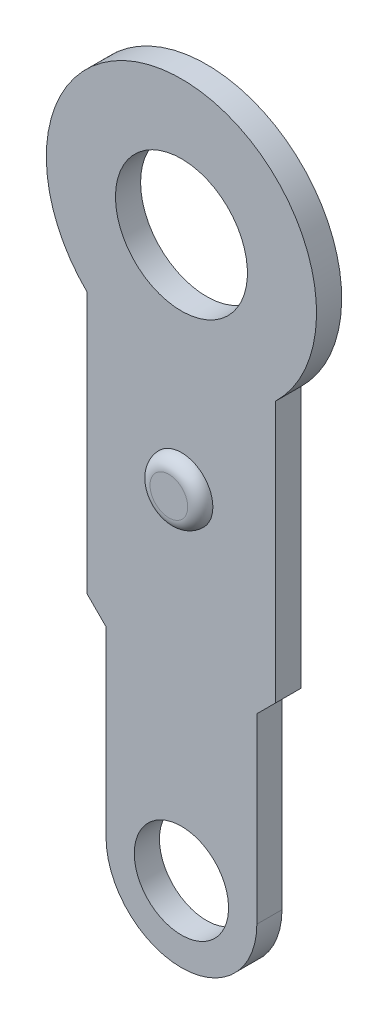
ISO-10303-21;
HEADER;
FILE_DESCRIPTION(('STEP AP214'),'2;1');
FILE_NAME('part.step','',(''),(''),'','','');
FILE_SCHEMA(('AUTOMOTIVE_DESIGN { 1 0 10303 214 1 1 1 1 }'));
ENDSEC;
DATA;
#1=APPLICATION_CONTEXT('core data for automotive mechanical design processes');
#2=APPLICATION_PROTOCOL_DEFINITION('international standard','automotive_design',2000,#1);
#3=PRODUCT_CONTEXT('',#1,'mechanical');
#4=PRODUCT('Part','Part','',(#3));
#5=PRODUCT_RELATED_PRODUCT_CATEGORY('part','',(#4));
#6=PRODUCT_DEFINITION_FORMATION('','',#4);
#7=PRODUCT_DEFINITION_CONTEXT('part definition',#1,'design');
#8=PRODUCT_DEFINITION('design','',#6,#7);
#9=PRODUCT_DEFINITION_SHAPE('','',#8);
#10=(LENGTH_UNIT() NAMED_UNIT(*) SI_UNIT(.MILLI.,.METRE.));
#11=(NAMED_UNIT(*) PLANE_ANGLE_UNIT() SI_UNIT($,.RADIAN.));
#12=(NAMED_UNIT(*) SI_UNIT($,.STERADIAN.) SOLID_ANGLE_UNIT());
#13=UNCERTAINTY_MEASURE_WITH_UNIT(LENGTH_MEASURE(1.E-05),#10,'distance_accuracy_value','');
#14=(GEOMETRIC_REPRESENTATION_CONTEXT(3) GLOBAL_UNCERTAINTY_ASSIGNED_CONTEXT((#13)) GLOBAL_UNIT_ASSIGNED_CONTEXT((#10,
#11,#12)) REPRESENTATION_CONTEXT('',''));
#15=CARTESIAN_POINT('',(0.,0.,0.));
#16=DIRECTION('',(0.,0.,1.));
#17=DIRECTION('',(1.,0.,0.));
#18=AXIS2_PLACEMENT_3D('',#15,#16,#17);
#19=CARTESIAN_POINT('',(0.,-3.5,0.6));
#20=DIRECTION('',(0.,0.,1.));
#21=DIRECTION('',(1.,0.,0.));
#22=AXIS2_PLACEMENT_3D('',#19,#20,#21);
#23=PLANE('',#22);
#24=CARTESIAN_POINT('',(0.,-3.5,0.6));
#25=DIRECTION('',(0.,0.,1.));
#26=DIRECTION('',(1.,0.,0.));
#27=AXIS2_PLACEMENT_3D('',#24,#25,#26);
#28=CIRCLE('',#27,0.3);
#29=CARTESIAN_POINT('',(0.3,-3.5,0.6));
#30=VERTEX_POINT('',#29);
#31=EDGE_CURVE('E20',#30,#30,#28,.F.);
#32=ORIENTED_EDGE('',*,*,#31,.F.);
#33=EDGE_LOOP('',(#32));
#34=FACE_BOUND('',#33,.T.);
#35=ADVANCED_FACE('F16',(#34),#23,.T.);
#36=CARTESIAN_POINT('',(0.,-3.5,0.4));
#37=DIRECTION('',(0.,0.,1.));
#38=DIRECTION('',(1.,0.,0.));
#39=AXIS2_PLACEMENT_3D('',#36,#37,#38);
#40=TOROIDAL_SURFACE('',#39,0.3,0.2);
#41=ORIENTED_EDGE('',*,*,#31,.T.);
#42=EDGE_LOOP('',(#41));
#43=FACE_BOUND('',#42,.T.);
#44=CARTESIAN_POINT('',(0.,-3.5,0.4));
#45=DIRECTION('',(0.,0.,1.));
#46=DIRECTION('',(1.,0.,0.));
#47=AXIS2_PLACEMENT_3D('',#44,#45,#46);
#48=CIRCLE('',#47,0.5);
#49=CARTESIAN_POINT('',(0.5,-3.5,0.4));
#50=VERTEX_POINT('',#49);
#51=EDGE_CURVE('E155',#50,#50,#48,.F.);
#52=ORIENTED_EDGE('',*,*,#51,.F.);
#53=EDGE_LOOP('',(#52));
#54=FACE_BOUND('',#53,.T.);
#55=ADVANCED_FACE('F18',(#43,#54),#40,.T.);
#56=CARTESIAN_POINT('',(0.,0.,0.4));
#57=DIRECTION('',(0.,0.,1.));
#58=DIRECTION('',(1.,0.,0.));
#59=AXIS2_PLACEMENT_3D('',#56,#57,#58);
#60=PLANE('',#59);
#61=CARTESIAN_POINT('',(0.,-8.9,0.4));
#62=DIRECTION('',(0.,0.,-1.));
#63=DIRECTION('',(-1.,0.,0.));
#64=AXIS2_PLACEMENT_3D('',#61,#62,#63);
#65=CIRCLE('',#64,0.75);
#66=CARTESIAN_POINT('',(-0.749999999999998,-8.9,0.4));
#67=VERTEX_POINT('',#66);
#68=EDGE_CURVE('E99',#67,#67,#65,.T.);
#69=ORIENTED_EDGE('',*,*,#68,.T.);
#70=EDGE_LOOP('',(#69));
#71=FACE_BOUND('',#70,.T.);
#72=CARTESIAN_POINT('',(0.,-8.9,0.4));
#73=DIRECTION('',(0.,0.,-1.));
#74=DIRECTION('',(-1.,0.,0.));
#75=AXIS2_PLACEMENT_3D('',#72,#73,#74);
#76=CIRCLE('',#75,1.2);
#77=CARTESIAN_POINT('',(1.2,-8.9,0.4));
#78=VERTEX_POINT('',#77);
#79=CARTESIAN_POINT('',(-1.2,-8.9,0.4));
#80=VERTEX_POINT('',#79);
#81=EDGE_CURVE('E64',#78,#80,#76,.T.);
#82=ORIENTED_EDGE('',*,*,#81,.F.);
#83=DIRECTION('',(0.,-1.,0.));
#84=VECTOR('',#83,1.);
#85=CARTESIAN_POINT('',(1.2,-8.9,0.4));
#86=LINE('',#85,#84);
#87=CARTESIAN_POINT('',(1.2,-6.,0.4));
#88=VERTEX_POINT('',#87);
#89=EDGE_CURVE('E130',#78,#88,#86,.F.);
#90=ORIENTED_EDGE('',*,*,#89,.T.);
#91=DIRECTION('',(-0.707106781186548,-0.707106781186548,0.));
#92=VECTOR('',#91,1.);
#93=CARTESIAN_POINT('',(1.5,-5.7,0.4));
#94=LINE('',#93,#92);
#95=CARTESIAN_POINT('',(1.5,-5.7,0.4));
#96=VERTEX_POINT('',#95);
#97=EDGE_CURVE('E125',#88,#96,#94,.F.);
#98=ORIENTED_EDGE('',*,*,#97,.T.);
#99=DIRECTION('',(0.,-1.,0.));
#100=VECTOR('',#99,1.);
#101=CARTESIAN_POINT('',(1.5,-1.540292180075,0.4));
#102=LINE('',#101,#100);
#103=CARTESIAN_POINT('',(1.49999999999998,-1.54029218007495,0.4));
#104=VERTEX_POINT('',#103);
#105=EDGE_CURVE('E119',#96,#104,#102,.F.);
#106=ORIENTED_EDGE('',*,*,#105,.T.);
#107=CARTESIAN_POINT('',(0.,0.,0.4));
#108=DIRECTION('',(0.,0.,-1.));
#109=DIRECTION('',(-1.,0.,0.));
#110=AXIS2_PLACEMENT_3D('',#107,#108,#109);
#111=CIRCLE('',#110,2.15);
#112=CARTESIAN_POINT('',(-1.5,-1.54029218007497,0.4));
#113=VERTEX_POINT('',#112);
#114=EDGE_CURVE('E110',#113,#104,#111,.T.);
#115=ORIENTED_EDGE('',*,*,#114,.F.);
#116=DIRECTION('',(0.,1.,0.));
#117=VECTOR('',#116,1.);
#118=CARTESIAN_POINT('',(-1.5,-1.540292180075,0.4));
#119=LINE('',#118,#117);
#120=CARTESIAN_POINT('',(-1.5,-5.7,0.4));
#121=VERTEX_POINT('',#120);
#122=EDGE_CURVE('E104',#113,#121,#119,.F.);
#123=ORIENTED_EDGE('',*,*,#122,.T.);
#124=DIRECTION('',(-0.707106781186548,0.707106781186548,0.));
#125=VECTOR('',#124,1.);
#126=CARTESIAN_POINT('',(-1.5,-5.7,0.4));
#127=LINE('',#126,#125);
#128=CARTESIAN_POINT('',(-1.2,-6.,0.4));
#129=VERTEX_POINT('',#128);
#130=EDGE_CURVE('E73',#121,#129,#127,.F.);
#131=ORIENTED_EDGE('',*,*,#130,.T.);
#132=DIRECTION('',(0.,1.,0.));
#133=VECTOR('',#132,1.);
#134=CARTESIAN_POINT('',(-1.2,-8.9,0.4));
#135=LINE('',#134,#133);
#136=EDGE_CURVE('E135',#129,#80,#135,.F.);
#137=ORIENTED_EDGE('',*,*,#136,.T.);
#138=EDGE_LOOP('',(#82,#90,#98,#106,#115,#123,#131,#137));
#139=FACE_BOUND('',#138,.T.);
#140=CARTESIAN_POINT('',(0.,0.,0.4));
#141=DIRECTION('',(0.,0.,-1.));
#142=DIRECTION('',(-1.,0.,0.));
#143=AXIS2_PLACEMENT_3D('',#140,#141,#142);
#144=CIRCLE('',#143,1.05);
#145=CARTESIAN_POINT('',(-1.05,0.,0.4));
#146=VERTEX_POINT('',#145);
#147=EDGE_CURVE('E105',#146,#146,#144,.T.);
#148=ORIENTED_EDGE('',*,*,#147,.T.);
#149=EDGE_LOOP('',(#148));
#150=FACE_BOUND('',#149,.T.);
#151=ORIENTED_EDGE('',*,*,#51,.T.);
#152=EDGE_LOOP('',(#151));
#153=FACE_BOUND('',#152,.T.);
#154=ADVANCED_FACE('F107',(#71,#139,#150,#153),#60,.T.);
#155=CARTESIAN_POINT('',(0.,-8.9,0.4));
#156=DIRECTION('',(0.,0.,-1.));
#157=DIRECTION('',(-1.,0.,0.));
#158=AXIS2_PLACEMENT_3D('',#155,#156,#157);
#159=CYLINDRICAL_SURFACE('',#158,0.75);
#160=ORIENTED_EDGE('',*,*,#68,.F.);
#161=EDGE_LOOP('',(#160));
#162=FACE_BOUND('',#161,.T.);
#163=CARTESIAN_POINT('',(0.,-8.9,0.));
#164=DIRECTION('',(0.,0.,-1.));
#165=DIRECTION('',(-1.,0.,0.));
#166=AXIS2_PLACEMENT_3D('',#163,#164,#165);
#167=CIRCLE('',#166,0.75);
#168=CARTESIAN_POINT('',(-0.749999999999998,-8.9,0.));
#169=VERTEX_POINT('',#168);
#170=EDGE_CURVE('E146',#169,#169,#167,.T.);
#171=ORIENTED_EDGE('',*,*,#170,.T.);
#172=EDGE_LOOP('',(#171));
#173=FACE_BOUND('',#172,.T.);
#174=ADVANCED_FACE('F208',(#162,#173),#159,.F.);
#175=CARTESIAN_POINT('',(-1.5,-5.7,0.4));
#176=DIRECTION('',(0.707106781186548,0.707106781186548,0.));
#177=DIRECTION('',(-0.707106781186548,0.707106781186548,0.));
#178=AXIS2_PLACEMENT_3D('',#175,#176,#177);
#179=PLANE('',#178);
#180=ORIENTED_EDGE('',*,*,#130,.F.);
#181=DIRECTION('',(0.,0.,1.));
#182=VECTOR('',#181,1.);
#183=CARTESIAN_POINT('',(-1.5,-5.7,0.4));
#184=LINE('',#183,#182);
#185=CARTESIAN_POINT('',(-1.5,-5.7,0.));
#186=VERTEX_POINT('',#185);
#187=EDGE_CURVE('E96',#121,#186,#184,.F.);
#188=ORIENTED_EDGE('',*,*,#187,.T.);
#189=DIRECTION('',(0.707106781186548,-0.707106781186547,0.));
#190=VECTOR('',#189,1.);
#191=CARTESIAN_POINT('',(-1.5,-5.7,0.));
#192=LINE('',#191,#190);
#193=CARTESIAN_POINT('',(-1.2,-6.,0.));
#194=VERTEX_POINT('',#193);
#195=EDGE_CURVE('E90',#186,#194,#192,.T.);
#196=ORIENTED_EDGE('',*,*,#195,.T.);
#197=DIRECTION('',(0.,0.,1.));
#198=VECTOR('',#197,1.);
#199=CARTESIAN_POINT('',(-1.2,-6.,0.4));
#200=LINE('',#199,#198);
#201=EDGE_CURVE('E98',#194,#129,#200,.T.);
#202=ORIENTED_EDGE('',*,*,#201,.T.);
#203=EDGE_LOOP('',(#180,#188,#196,#202));
#204=FACE_BOUND('',#203,.T.);
#205=ADVANCED_FACE('F95',(#204),#179,.F.);
#206=CARTESIAN_POINT('',(-1.2,-8.9,0.4));
#207=DIRECTION('',(1.,0.,0.));
#208=DIRECTION('',(0.,1.,0.));
#209=AXIS2_PLACEMENT_3D('',#206,#207,#208);
#210=PLANE('',#209);
#211=ORIENTED_EDGE('',*,*,#136,.F.);
#212=ORIENTED_EDGE('',*,*,#201,.F.);
#213=DIRECTION('',(0.,1.,0.));
#214=VECTOR('',#213,1.);
#215=CARTESIAN_POINT('',(-1.2,0.,0.));
#216=LINE('',#215,#214);
#217=CARTESIAN_POINT('',(-1.2,-8.9,0.));
#218=VERTEX_POINT('',#217);
#219=EDGE_CURVE('E145',#194,#218,#216,.F.);
#220=ORIENTED_EDGE('',*,*,#219,.T.);
#221=DIRECTION('',(0.,0.,-1.));
#222=VECTOR('',#221,1.);
#223=CARTESIAN_POINT('',(-1.2,-8.9,0.4));
#224=LINE('',#223,#222);
#225=EDGE_CURVE('E153',#80,#218,#224,.T.);
#226=ORIENTED_EDGE('',*,*,#225,.F.);
#227=EDGE_LOOP('',(#211,#212,#220,#226));
#228=FACE_BOUND('',#227,.T.);
#229=ADVANCED_FACE('F202',(#228),#210,.F.);
#230=CARTESIAN_POINT('',(0.,-8.9,0.4));
#231=DIRECTION('',(0.,0.,-1.));
#232=DIRECTION('',(-1.,0.,0.));
#233=AXIS2_PLACEMENT_3D('',#230,#231,#232);
#234=CYLINDRICAL_SURFACE('',#233,1.2);
#235=CARTESIAN_POINT('',(0.,-8.9,0.));
#236=DIRECTION('',(0.,0.,-1.));
#237=DIRECTION('',(-1.,0.,0.));
#238=AXIS2_PLACEMENT_3D('',#235,#236,#237);
#239=CIRCLE('',#238,1.2);
#240=CARTESIAN_POINT('',(1.2,-8.9,0.));
#241=VERTEX_POINT('',#240);
#242=EDGE_CURVE('E141',#218,#241,#239,.F.);
#243=ORIENTED_EDGE('',*,*,#242,.T.);
#244=DIRECTION('',(0.,0.,1.));
#245=VECTOR('',#244,1.);
#246=CARTESIAN_POINT('',(1.2,-8.9,0.4));
#247=LINE('',#246,#245);
#248=EDGE_CURVE('E132',#241,#78,#247,.T.);
#249=ORIENTED_EDGE('',*,*,#248,.T.);
#250=ORIENTED_EDGE('',*,*,#81,.T.);
#251=ORIENTED_EDGE('',*,*,#225,.T.);
#252=EDGE_LOOP('',(#243,#249,#250,#251));
#253=FACE_BOUND('',#252,.T.);
#254=ADVANCED_FACE('F198',(#253),#234,.T.);
#255=CARTESIAN_POINT('',(1.2,-8.9,0.4));
#256=DIRECTION('',(-1.,0.,0.));
#257=DIRECTION('',(0.,-1.,0.));
#258=AXIS2_PLACEMENT_3D('',#255,#256,#257);
#259=PLANE('',#258);
#260=ORIENTED_EDGE('',*,*,#89,.F.);
#261=ORIENTED_EDGE('',*,*,#248,.F.);
#262=DIRECTION('',(0.,1.,0.));
#263=VECTOR('',#262,1.);
#264=CARTESIAN_POINT('',(1.2,0.,0.));
#265=LINE('',#264,#263);
#266=CARTESIAN_POINT('',(1.2,-6.,0.));
#267=VERTEX_POINT('',#266);
#268=EDGE_CURVE('E144',#241,#267,#265,.T.);
#269=ORIENTED_EDGE('',*,*,#268,.T.);
#270=DIRECTION('',(0.,0.,1.));
#271=VECTOR('',#270,1.);
#272=CARTESIAN_POINT('',(1.2,-6.,0.4));
#273=LINE('',#272,#271);
#274=EDGE_CURVE('E127',#267,#88,#273,.T.);
#275=ORIENTED_EDGE('',*,*,#274,.T.);
#276=EDGE_LOOP('',(#260,#261,#269,#275));
#277=FACE_BOUND('',#276,.T.);
#278=ADVANCED_FACE('F194',(#277),#259,.F.);
#279=CARTESIAN_POINT('',(1.5,-5.7,0.4));
#280=DIRECTION('',(-0.707106781186548,0.707106781186548,0.));
#281=DIRECTION('',(-0.707106781186548,-0.707106781186548,0.));
#282=AXIS2_PLACEMENT_3D('',#279,#280,#281);
#283=PLANE('',#282);
#284=ORIENTED_EDGE('',*,*,#97,.F.);
#285=ORIENTED_EDGE('',*,*,#274,.F.);
#286=DIRECTION('',(0.707106781186548,0.707106781186547,0.));
#287=VECTOR('',#286,1.);
#288=CARTESIAN_POINT('',(1.2,-6.,0.));
#289=LINE('',#288,#287);
#290=CARTESIAN_POINT('',(1.5,-5.7,0.));
#291=VERTEX_POINT('',#290);
#292=EDGE_CURVE('E319',#267,#291,#289,.T.);
#293=ORIENTED_EDGE('',*,*,#292,.T.);
#294=DIRECTION('',(0.,0.,1.));
#295=VECTOR('',#294,1.);
#296=CARTESIAN_POINT('',(1.5,-5.7,0.4));
#297=LINE('',#296,#295);
#298=EDGE_CURVE('E122',#291,#96,#297,.T.);
#299=ORIENTED_EDGE('',*,*,#298,.T.);
#300=EDGE_LOOP('',(#284,#285,#293,#299));
#301=FACE_BOUND('',#300,.T.);
#302=ADVANCED_FACE('F190',(#301),#283,.F.);
#303=CARTESIAN_POINT('',(1.5,-1.540292180075,0.4));
#304=DIRECTION('',(-1.,0.,0.));
#305=DIRECTION('',(0.,-1.,0.));
#306=AXIS2_PLACEMENT_3D('',#303,#304,#305);
#307=PLANE('',#306);
#308=ORIENTED_EDGE('',*,*,#105,.F.);
#309=ORIENTED_EDGE('',*,*,#298,.F.);
#310=DIRECTION('',(0.,1.,0.));
#311=VECTOR('',#310,1.);
#312=CARTESIAN_POINT('',(1.5,0.,0.));
#313=LINE('',#312,#311);
#314=CARTESIAN_POINT('',(1.49999999999998,-1.54029218007495,0.));
#315=VERTEX_POINT('',#314);
#316=EDGE_CURVE('E140',#291,#315,#313,.T.);
#317=ORIENTED_EDGE('',*,*,#316,.T.);
#318=DIRECTION('',(0.,0.,-1.));
#319=VECTOR('',#318,1.);
#320=CARTESIAN_POINT('',(1.49999999999997,-1.54029218007497,0.4));
#321=LINE('',#320,#319);
#322=EDGE_CURVE('E121',#104,#315,#321,.T.);
#323=ORIENTED_EDGE('',*,*,#322,.F.);
#324=EDGE_LOOP('',(#308,#309,#317,#323));
#325=FACE_BOUND('',#324,.T.);
#326=ADVANCED_FACE('F187',(#325),#307,.F.);
#327=CARTESIAN_POINT('',(0.,0.,0.4));
#328=DIRECTION('',(0.,0.,-1.));
#329=DIRECTION('',(-1.,0.,0.));
#330=AXIS2_PLACEMENT_3D('',#327,#328,#329);
#331=CYLINDRICAL_SURFACE('',#330,2.15);
#332=CARTESIAN_POINT('',(0.,0.,0.));
#333=DIRECTION('',(0.,0.,-1.));
#334=DIRECTION('',(-1.,0.,0.));
#335=AXIS2_PLACEMENT_3D('',#332,#333,#334);
#336=CIRCLE('',#335,2.15);
#337=CARTESIAN_POINT('',(-1.5,-1.54029218007497,0.));
#338=VERTEX_POINT('',#337);
#339=EDGE_CURVE('E35',#315,#338,#336,.F.);
#340=ORIENTED_EDGE('',*,*,#339,.T.);
#341=DIRECTION('',(0.,0.,1.));
#342=VECTOR('',#341,1.);
#343=CARTESIAN_POINT('',(-1.5,-1.540292180075,0.4));
#344=LINE('',#343,#342);
#345=EDGE_CURVE('E111',#338,#113,#344,.T.);
#346=ORIENTED_EDGE('',*,*,#345,.T.);
#347=ORIENTED_EDGE('',*,*,#114,.T.);
#348=ORIENTED_EDGE('',*,*,#322,.T.);
#349=EDGE_LOOP('',(#340,#346,#347,#348));
#350=FACE_BOUND('',#349,.T.);
#351=ADVANCED_FACE('F184',(#350),#331,.T.);
#352=CARTESIAN_POINT('',(-1.5,-1.540292180075,0.4));
#353=DIRECTION('',(1.,0.,0.));
#354=DIRECTION('',(0.,1.,0.));
#355=AXIS2_PLACEMENT_3D('',#352,#353,#354);
#356=PLANE('',#355);
#357=ORIENTED_EDGE('',*,*,#122,.F.);
#358=ORIENTED_EDGE('',*,*,#345,.F.);
#359=DIRECTION('',(0.,1.,0.));
#360=VECTOR('',#359,1.);
#361=CARTESIAN_POINT('',(-1.5,0.,0.));
#362=LINE('',#361,#360);
#363=EDGE_CURVE('E26',#338,#186,#362,.F.);
#364=ORIENTED_EDGE('',*,*,#363,.T.);
#365=ORIENTED_EDGE('',*,*,#187,.F.);
#366=EDGE_LOOP('',(#357,#358,#364,#365));
#367=FACE_BOUND('',#366,.T.);
#368=ADVANCED_FACE('F103',(#367),#356,.F.);
#369=CARTESIAN_POINT('',(0.,0.,0.4));
#370=DIRECTION('',(0.,0.,-1.));
#371=DIRECTION('',(-1.,0.,0.));
#372=AXIS2_PLACEMENT_3D('',#369,#370,#371);
#373=CYLINDRICAL_SURFACE('',#372,1.05);
#374=ORIENTED_EDGE('',*,*,#147,.F.);
#375=EDGE_LOOP('',(#374));
#376=FACE_BOUND('',#375,.T.);
#377=CARTESIAN_POINT('',(0.,0.,0.));
#378=DIRECTION('',(0.,0.,-1.));
#379=DIRECTION('',(-1.,0.,0.));
#380=AXIS2_PLACEMENT_3D('',#377,#378,#379);
#381=CIRCLE('',#380,1.05);
#382=CARTESIAN_POINT('',(-1.05,0.,0.));
#383=VERTEX_POINT('',#382);
#384=EDGE_CURVE('E11',#383,#383,#381,.T.);
#385=ORIENTED_EDGE('',*,*,#384,.T.);
#386=EDGE_LOOP('',(#385));
#387=FACE_BOUND('',#386,.T.);
#388=ADVANCED_FACE('F172',(#376,#387),#373,.F.);
#389=CARTESIAN_POINT('',(0.,0.,0.));
#390=DIRECTION('',(0.,0.,1.));
#391=DIRECTION('',(1.,0.,0.));
#392=AXIS2_PLACEMENT_3D('',#389,#390,#391);
#393=PLANE('',#392);
#394=ORIENTED_EDGE('',*,*,#384,.F.);
#395=EDGE_LOOP('',(#394));
#396=FACE_BOUND('',#395,.T.);
#397=ORIENTED_EDGE('',*,*,#363,.F.);
#398=ORIENTED_EDGE('',*,*,#339,.F.);
#399=ORIENTED_EDGE('',*,*,#316,.F.);
#400=ORIENTED_EDGE('',*,*,#292,.F.);
#401=ORIENTED_EDGE('',*,*,#268,.F.);
#402=ORIENTED_EDGE('',*,*,#242,.F.);
#403=ORIENTED_EDGE('',*,*,#219,.F.);
#404=ORIENTED_EDGE('',*,*,#195,.F.);
#405=EDGE_LOOP('',(#397,#398,#399,#400,#401,#402,#403,#404));
#406=FACE_BOUND('',#405,.T.);
#407=ORIENTED_EDGE('',*,*,#170,.F.);
#408=EDGE_LOOP('',(#407));
#409=FACE_BOUND('',#408,.T.);
#410=ADVANCED_FACE('F170',(#396,#406,#409),#393,.F.);
#411=CLOSED_SHELL('',(#35,#55,#154,#174,#205,#229,#254,#278,#302,#326,#351,#368,#388,#410));
#412=MANIFOLD_SOLID_BREP('B1',#411);
#413=ADVANCED_BREP_SHAPE_REPRESENTATION('',(#18,#412),#14);
#414=SHAPE_DEFINITION_REPRESENTATION(#9,#413);
ENDSEC;
END-ISO-10303-21;
